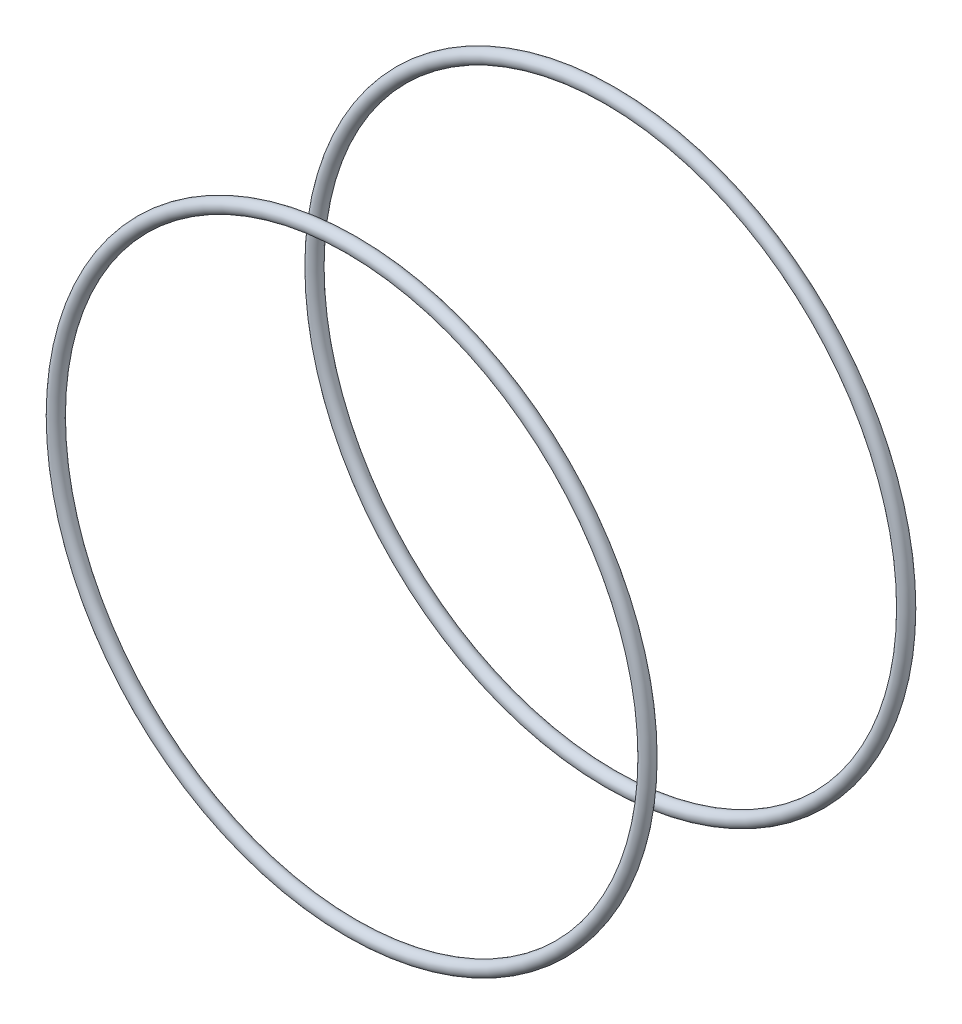
ISO-10303-21;
HEADER;
FILE_DESCRIPTION(('STEP AP214'),'2;1');
FILE_NAME('part.step','',(''),(''),'','','');
FILE_SCHEMA(('AUTOMOTIVE_DESIGN { 1 0 10303 214 1 1 1 1 }'));
ENDSEC;
DATA;
#1=APPLICATION_CONTEXT('core data for automotive mechanical design processes');
#2=APPLICATION_PROTOCOL_DEFINITION('international standard','automotive_design',2000,#1);
#3=PRODUCT_CONTEXT('',#1,'mechanical');
#4=PRODUCT('Part','Part','',(#3));
#5=PRODUCT_RELATED_PRODUCT_CATEGORY('part','',(#4));
#6=PRODUCT_DEFINITION_FORMATION('','',#4);
#7=PRODUCT_DEFINITION_CONTEXT('part definition',#1,'design');
#8=PRODUCT_DEFINITION('design','',#6,#7);
#9=PRODUCT_DEFINITION_SHAPE('','',#8);
#10=(LENGTH_UNIT() NAMED_UNIT(*) SI_UNIT(.MILLI.,.METRE.));
#11=(NAMED_UNIT(*) PLANE_ANGLE_UNIT() SI_UNIT($,.RADIAN.));
#12=(NAMED_UNIT(*) SI_UNIT($,.STERADIAN.) SOLID_ANGLE_UNIT());
#13=UNCERTAINTY_MEASURE_WITH_UNIT(LENGTH_MEASURE(1.E-05),#10,'distance_accuracy_value','');
#14=(GEOMETRIC_REPRESENTATION_CONTEXT(3) GLOBAL_UNCERTAINTY_ASSIGNED_CONTEXT((#13)) GLOBAL_UNIT_ASSIGNED_CONTEXT((#10,
#11,#12)) REPRESENTATION_CONTEXT('',''));
#15=CARTESIAN_POINT('',(0.,0.,0.));
#16=DIRECTION('',(0.,0.,1.));
#17=DIRECTION('',(1.,0.,0.));
#18=AXIS2_PLACEMENT_3D('',#15,#16,#17);
#19=CARTESIAN_POINT('',(0.,0.,4.125));
#20=DIRECTION('',(0.,0.,-1.));
#21=DIRECTION('',(1.,0.,0.));
#22=AXIS2_PLACEMENT_3D('',#19,#20,#21);
#23=TOROIDAL_SURFACE('',#22,3.26,0.075);
#24=ADVANCED_FACE('P0_F14',(),#23,.T.);
#25=CLOSED_SHELL('',(#24));
#26=MANIFOLD_SOLID_BREP('P0_B1',#25);
#27=CARTESIAN_POINT('',(0.,0.,1.275));
#28=DIRECTION('',(0.,0.,-1.));
#29=DIRECTION('',(1.,0.,0.));
#30=AXIS2_PLACEMENT_3D('',#27,#28,#29);
#31=TOROIDAL_SURFACE('',#30,3.26,0.075);
#32=ADVANCED_FACE('P1_F14',(),#31,.T.);
#33=CLOSED_SHELL('',(#32));
#34=MANIFOLD_SOLID_BREP('P1_B1',#33);
#35=ADVANCED_BREP_SHAPE_REPRESENTATION('',(#18,#26,#34),#14);
#36=SHAPE_DEFINITION_REPRESENTATION(#9,#35);
ENDSEC;
END-ISO-10303-21;
